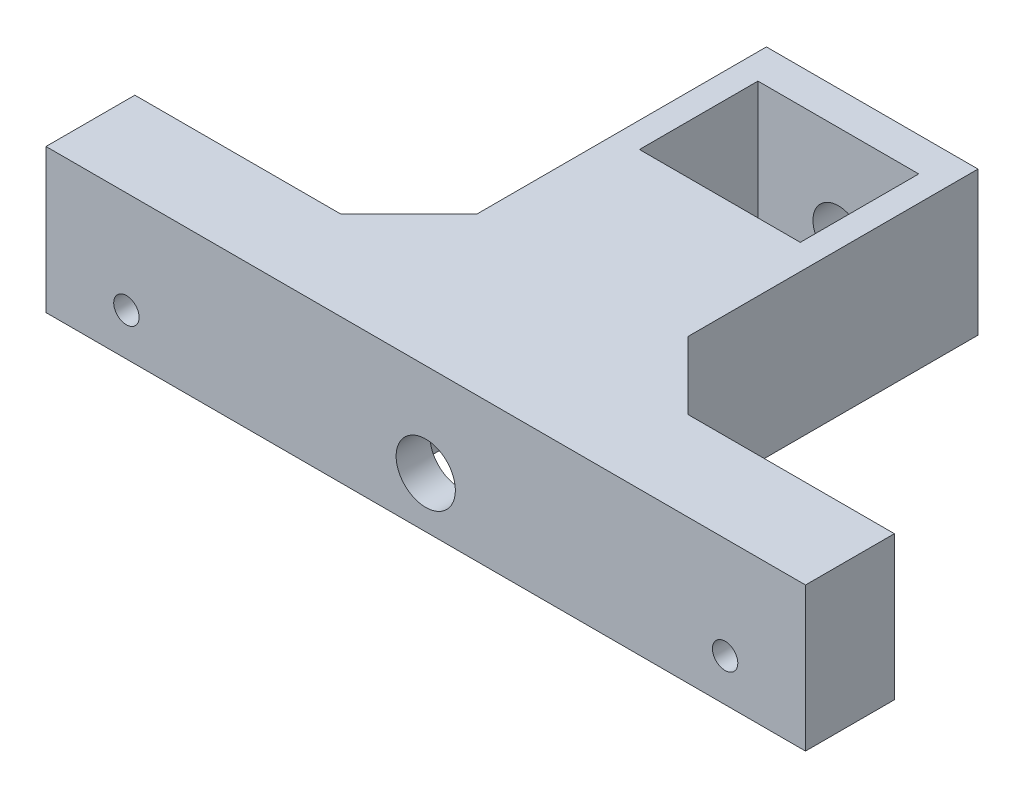
ISO-10303-21;
HEADER;
FILE_DESCRIPTION(('STEP AP214'),'2;1');
FILE_NAME('part.step','',(''),(''),'','','');
FILE_SCHEMA(('AUTOMOTIVE_DESIGN { 1 0 10303 214 1 1 1 1 }'));
ENDSEC;
DATA;
#1=APPLICATION_CONTEXT('core data for automotive mechanical design processes');
#2=APPLICATION_PROTOCOL_DEFINITION('international standard','automotive_design',2000,#1);
#3=PRODUCT_CONTEXT('',#1,'mechanical');
#4=PRODUCT('Part','Part','',(#3));
#5=PRODUCT_RELATED_PRODUCT_CATEGORY('part','',(#4));
#6=PRODUCT_DEFINITION_FORMATION('','',#4);
#7=PRODUCT_DEFINITION_CONTEXT('part definition',#1,'design');
#8=PRODUCT_DEFINITION('design','',#6,#7);
#9=PRODUCT_DEFINITION_SHAPE('','',#8);
#10=(LENGTH_UNIT() NAMED_UNIT(*) SI_UNIT(.MILLI.,.METRE.));
#11=(NAMED_UNIT(*) PLANE_ANGLE_UNIT() SI_UNIT($,.RADIAN.));
#12=(NAMED_UNIT(*) SI_UNIT($,.STERADIAN.) SOLID_ANGLE_UNIT());
#13=UNCERTAINTY_MEASURE_WITH_UNIT(LENGTH_MEASURE(1.E-05),#10,'distance_accuracy_value','');
#14=(GEOMETRIC_REPRESENTATION_CONTEXT(3) GLOBAL_UNCERTAINTY_ASSIGNED_CONTEXT((#13)) GLOBAL_UNIT_ASSIGNED_CONTEXT((#10,
#11,#12)) REPRESENTATION_CONTEXT('',''));
#15=CARTESIAN_POINT('',(0.,0.,0.));
#16=DIRECTION('',(0.,0.,1.));
#17=DIRECTION('',(1.,0.,0.));
#18=AXIS2_PLACEMENT_3D('',#15,#16,#17);
#19=CARTESIAN_POINT('',(7.5,12.,-4.));
#20=DIRECTION('',(0.,0.,-1.));
#21=DIRECTION('',(-1.,0.,0.));
#22=AXIS2_PLACEMENT_3D('',#19,#20,#21);
#23=PLANE('',#22);
#24=DIRECTION('',(1.,0.,0.));
#25=VECTOR('',#24,1.);
#26=CARTESIAN_POINT('',(7.5,12.,-4.));
#27=LINE('',#26,#25);
#28=CARTESIAN_POINT('',(-3.50000000000001,12.,-4.));
#29=VERTEX_POINT('',#28);
#30=CARTESIAN_POINT('',(3.49999999999997,12.,-4.));
#31=VERTEX_POINT('',#30);
#32=EDGE_CURVE('E322',#29,#31,#27,.T.);
#33=ORIENTED_EDGE('',*,*,#32,.T.);
#34=DIRECTION('',(0.,-1.,0.));
#35=VECTOR('',#34,1.);
#36=CARTESIAN_POINT('',(3.49999999999997,0.,-4.));
#37=LINE('',#36,#35);
#38=CARTESIAN_POINT('',(3.49999999999997,6.,-4.));
#39=VERTEX_POINT('',#38);
#40=EDGE_CURVE('E454',#31,#39,#37,.T.);
#41=ORIENTED_EDGE('',*,*,#40,.T.);
#42=CARTESIAN_POINT('',(0.,6.,-4.));
#43=DIRECTION('',(0.,0.,-1.));
#44=DIRECTION('',(-1.,0.,0.));
#45=AXIS2_PLACEMENT_3D('',#42,#43,#44);
#46=CIRCLE('',#45,3.5);
#47=CARTESIAN_POINT('',(-3.50000000000001,6.,-4.));
#48=VERTEX_POINT('',#47);
#49=EDGE_CURVE('E606',#39,#48,#46,.F.);
#50=ORIENTED_EDGE('',*,*,#49,.T.);
#51=DIRECTION('',(0.,1.,0.));
#52=VECTOR('',#51,1.);
#53=CARTESIAN_POINT('',(-3.50000000000001,12.,-4.));
#54=LINE('',#53,#52);
#55=EDGE_CURVE('E448',#48,#29,#54,.T.);
#56=ORIENTED_EDGE('',*,*,#55,.T.);
#57=EDGE_LOOP('',(#33,#41,#50,#56));
#58=FACE_BOUND('',#57,.T.);
#59=ADVANCED_FACE('F43',(#58),#23,.T.);
#60=CARTESIAN_POINT('',(44.87,12.,0.));
#61=DIRECTION('',(0.,0.,-1.));
#62=DIRECTION('',(-1.,0.,0.));
#63=AXIS2_PLACEMENT_3D('',#60,#61,#62);
#64=PLANE('',#63);
#65=CARTESIAN_POINT('',(0.,6.,0.));
#66=DIRECTION('',(0.,0.,1.));
#67=DIRECTION('',(1.,0.,0.));
#68=AXIS2_PLACEMENT_3D('',#65,#66,#67);
#69=CIRCLE('',#68,3.5);
#70=CARTESIAN_POINT('',(3.5,6.,0.));
#71=VERTEX_POINT('',#70);
#72=EDGE_CURVE('E611',#71,#71,#69,.T.);
#73=ORIENTED_EDGE('',*,*,#72,.F.);
#74=EDGE_LOOP('',(#73));
#75=FACE_BOUND('',#74,.T.);
#76=DIRECTION('',(1.,0.,0.));
#77=VECTOR('',#76,1.);
#78=CARTESIAN_POINT('',(44.87,0.,0.));
#79=LINE('',#78,#77);
#80=CARTESIAN_POINT('',(-44.87,0.,0.));
#81=VERTEX_POINT('',#80);
#82=CARTESIAN_POINT('',(44.87,0.,0.));
#83=VERTEX_POINT('',#82);
#84=EDGE_CURVE('E404',#81,#83,#79,.T.);
#85=ORIENTED_EDGE('',*,*,#84,.T.);
#86=DIRECTION('',(0.,-1.,0.));
#87=VECTOR('',#86,1.);
#88=CARTESIAN_POINT('',(44.87,12.,0.));
#89=LINE('',#88,#87);
#90=CARTESIAN_POINT('',(44.87,17.,0.));
#91=VERTEX_POINT('',#90);
#92=EDGE_CURVE('E409',#91,#83,#89,.T.);
#93=ORIENTED_EDGE('',*,*,#92,.F.);
#94=DIRECTION('',(1.,0.,0.));
#95=VECTOR('',#94,1.);
#96=CARTESIAN_POINT('',(-44.87,17.,0.));
#97=LINE('',#96,#95);
#98=CARTESIAN_POINT('',(-44.87,17.,0.));
#99=VERTEX_POINT('',#98);
#100=EDGE_CURVE('E299',#99,#91,#97,.T.);
#101=ORIENTED_EDGE('',*,*,#100,.F.);
#102=DIRECTION('',(0.,-1.,0.));
#103=VECTOR('',#102,1.);
#104=CARTESIAN_POINT('',(-44.87,12.,0.));
#105=LINE('',#104,#103);
#106=EDGE_CURVE('E412',#99,#81,#105,.T.);
#107=ORIENTED_EDGE('',*,*,#106,.T.);
#108=EDGE_LOOP('',(#85,#93,#101,#107));
#109=FACE_BOUND('',#108,.T.);
#110=CARTESIAN_POINT('',(35.37,5.00000000000001,0.));
#111=DIRECTION('',(0.,0.,-1.));
#112=DIRECTION('',(-1.,0.,0.));
#113=AXIS2_PLACEMENT_3D('',#110,#111,#112);
#114=CIRCLE('',#113,1.5);
#115=CARTESIAN_POINT('',(33.87,5.00000000000001,0.));
#116=VERTEX_POINT('',#115);
#117=EDGE_CURVE('E302',#116,#116,#114,.T.);
#118=ORIENTED_EDGE('',*,*,#117,.T.);
#119=EDGE_LOOP('',(#118));
#120=FACE_BOUND('',#119,.T.);
#121=CARTESIAN_POINT('',(-35.37,5.,0.));
#122=DIRECTION('',(0.,0.,1.));
#123=DIRECTION('',(1.,0.,0.));
#124=AXIS2_PLACEMENT_3D('',#121,#122,#123);
#125=CIRCLE('',#124,1.5);
#126=CARTESIAN_POINT('',(-33.87,5.,0.));
#127=VERTEX_POINT('',#126);
#128=EDGE_CURVE('E307',#127,#127,#125,.T.);
#129=ORIENTED_EDGE('',*,*,#128,.F.);
#130=EDGE_LOOP('',(#129));
#131=FACE_BOUND('',#130,.T.);
#132=ADVANCED_FACE('F542',(#75,#109,#120,#131),#64,.F.);
#133=CARTESIAN_POINT('',(0.,0.,0.));
#134=DIRECTION('',(0.,-1.,0.));
#135=DIRECTION('',(0.,0.,-1.));
#136=AXIS2_PLACEMENT_3D('',#133,#134,#135);
#137=PLANE('',#136);
#138=DIRECTION('',(-1.,0.,0.));
#139=VECTOR('',#138,1.);
#140=CARTESIAN_POINT('',(39.87,0.,-10.5));
#141=LINE('',#140,#139);
#142=CARTESIAN_POINT('',(44.87,0.,-10.5));
#143=VERTEX_POINT('',#142);
#144=CARTESIAN_POINT('',(39.87,0.,-10.5));
#145=VERTEX_POINT('',#144);
#146=EDGE_CURVE('E257',#143,#145,#141,.T.);
#147=ORIENTED_EDGE('',*,*,#146,.F.);
#148=DIRECTION('',(0.,0.,-1.));
#149=VECTOR('',#148,1.);
#150=CARTESIAN_POINT('',(44.87,0.,-10.5));
#151=LINE('',#150,#149);
#152=EDGE_CURVE('E359',#83,#143,#151,.T.);
#153=ORIENTED_EDGE('',*,*,#152,.F.);
#154=ORIENTED_EDGE('',*,*,#84,.F.);
#155=DIRECTION('',(0.,0.,1.));
#156=VECTOR('',#155,1.);
#157=CARTESIAN_POINT('',(-44.87,0.,0.));
#158=LINE('',#157,#156);
#159=CARTESIAN_POINT('',(-44.87,0.,-10.5));
#160=VERTEX_POINT('',#159);
#161=EDGE_CURVE('E402',#160,#81,#158,.T.);
#162=ORIENTED_EDGE('',*,*,#161,.F.);
#163=DIRECTION('',(-1.,0.,0.));
#164=VECTOR('',#163,1.);
#165=CARTESIAN_POINT('',(-44.87,0.,-10.5));
#166=LINE('',#165,#164);
#167=CARTESIAN_POINT('',(-39.87,0.,-10.5));
#168=VERTEX_POINT('',#167);
#169=EDGE_CURVE('E400',#168,#160,#166,.T.);
#170=ORIENTED_EDGE('',*,*,#169,.F.);
#171=DIRECTION('',(0.,0.,-1.));
#172=VECTOR('',#171,1.);
#173=CARTESIAN_POINT('',(-39.87,0.,-10.5));
#174=LINE('',#173,#172);
#175=CARTESIAN_POINT('',(-39.87,0.,-4.));
#176=VERTEX_POINT('',#175);
#177=EDGE_CURVE('E398',#176,#168,#174,.T.);
#178=ORIENTED_EDGE('',*,*,#177,.F.);
#179=DIRECTION('',(-1.,0.,0.));
#180=VECTOR('',#179,1.);
#181=CARTESIAN_POINT('',(-39.87,0.,-4.));
#182=LINE('',#181,#180);
#183=CARTESIAN_POINT('',(-30.87,0.,-4.));
#184=VERTEX_POINT('',#183);
#185=EDGE_CURVE('E396',#184,#176,#182,.T.);
#186=ORIENTED_EDGE('',*,*,#185,.F.);
#187=DIRECTION('',(0.,0.,1.));
#188=VECTOR('',#187,1.);
#189=CARTESIAN_POINT('',(-30.87,0.,-4.));
#190=LINE('',#189,#188);
#191=CARTESIAN_POINT('',(-30.87,0.,-10.5));
#192=VERTEX_POINT('',#191);
#193=EDGE_CURVE('E394',#192,#184,#190,.T.);
#194=ORIENTED_EDGE('',*,*,#193,.F.);
#195=DIRECTION('',(-1.,0.,0.));
#196=VECTOR('',#195,1.);
#197=CARTESIAN_POINT('',(-30.87,0.,-10.5));
#198=LINE('',#197,#196);
#199=CARTESIAN_POINT('',(-20.5,0.,-10.5));
#200=VERTEX_POINT('',#199);
#201=EDGE_CURVE('E392',#200,#192,#198,.T.);
#202=ORIENTED_EDGE('',*,*,#201,.F.);
#203=DIRECTION('',(-0.70710678118655,0.,0.707106781186545));
#204=VECTOR('',#203,1.);
#205=CARTESIAN_POINT('',(-20.5,0.,-10.5));
#206=LINE('',#205,#204);
#207=CARTESIAN_POINT('',(-12.5,0.,-18.5));
#208=VERTEX_POINT('',#207);
#209=EDGE_CURVE('E52',#200,#208,#206,.F.);
#210=ORIENTED_EDGE('',*,*,#209,.T.);
#211=DIRECTION('',(0.,0.,1.));
#212=VECTOR('',#211,1.);
#213=CARTESIAN_POINT('',(-12.5,0.,-52.75));
#214=LINE('',#213,#212);
#215=CARTESIAN_POINT('',(-12.5,0.,-52.75));
#216=VERTEX_POINT('',#215);
#217=EDGE_CURVE('E390',#216,#208,#214,.T.);
#218=ORIENTED_EDGE('',*,*,#217,.F.);
#219=DIRECTION('',(-1.,0.,0.));
#220=VECTOR('',#219,1.);
#221=CARTESIAN_POINT('',(-12.5,0.,-52.75));
#222=LINE('',#221,#220);
#223=CARTESIAN_POINT('',(12.5,0.,-52.75));
#224=VERTEX_POINT('',#223);
#225=EDGE_CURVE('E388',#224,#216,#222,.T.);
#226=ORIENTED_EDGE('',*,*,#225,.F.);
#227=DIRECTION('',(0.,0.,-1.));
#228=VECTOR('',#227,1.);
#229=CARTESIAN_POINT('',(12.5,0.,-52.75));
#230=LINE('',#229,#228);
#231=CARTESIAN_POINT('',(12.5,0.,-18.5000000000001));
#232=VERTEX_POINT('',#231);
#233=EDGE_CURVE('E386',#232,#224,#230,.T.);
#234=ORIENTED_EDGE('',*,*,#233,.F.);
#235=DIRECTION('',(-0.707106781186544,0.,-0.707106781186551));
#236=VECTOR('',#235,1.);
#237=CARTESIAN_POINT('',(12.5,0.,-18.5000000000001));
#238=LINE('',#237,#236);
#239=CARTESIAN_POINT('',(20.5,0.,-10.5));
#240=VERTEX_POINT('',#239);
#241=EDGE_CURVE('E497',#232,#240,#238,.F.);
#242=ORIENTED_EDGE('',*,*,#241,.T.);
#243=DIRECTION('',(-1.,0.,0.));
#244=VECTOR('',#243,1.);
#245=CARTESIAN_POINT('',(12.5,0.,-10.5));
#246=LINE('',#245,#244);
#247=CARTESIAN_POINT('',(30.87,0.,-10.5));
#248=VERTEX_POINT('',#247);
#249=EDGE_CURVE('E383',#248,#240,#246,.T.);
#250=ORIENTED_EDGE('',*,*,#249,.F.);
#251=DIRECTION('',(0.,0.,-1.));
#252=VECTOR('',#251,1.);
#253=CARTESIAN_POINT('',(30.87,0.,-10.5));
#254=LINE('',#253,#252);
#255=CARTESIAN_POINT('',(30.87,0.,-4.00000000000001));
#256=VERTEX_POINT('',#255);
#257=EDGE_CURVE('E381',#256,#248,#254,.T.);
#258=ORIENTED_EDGE('',*,*,#257,.F.);
#259=DIRECTION('',(-1.,0.,0.));
#260=VECTOR('',#259,1.);
#261=CARTESIAN_POINT('',(30.87,0.,-4.00000000000001));
#262=LINE('',#261,#260);
#263=CARTESIAN_POINT('',(39.87,0.,-4.));
#264=VERTEX_POINT('',#263);
#265=EDGE_CURVE('E379',#264,#256,#262,.T.);
#266=ORIENTED_EDGE('',*,*,#265,.F.);
#267=DIRECTION('',(0.,0.,1.));
#268=VECTOR('',#267,1.);
#269=CARTESIAN_POINT('',(39.87,0.,-4.));
#270=LINE('',#269,#268);
#271=EDGE_CURVE('E377',#145,#264,#270,.T.);
#272=ORIENTED_EDGE('',*,*,#271,.F.);
#273=EDGE_LOOP('',(#147,#153,#154,#162,#170,#178,#186,#194,#202,#210,#218,#226,#234,#242,#250,
#258,#266,#272));
#274=FACE_BOUND('',#273,.T.);
#275=DIRECTION('',(-1.,0.,0.));
#276=VECTOR('',#275,1.);
#277=CARTESIAN_POINT('',(-9.5,0.,-48.75));
#278=LINE('',#277,#276);
#279=CARTESIAN_POINT('',(9.49999999999999,0.,-48.75));
#280=VERTEX_POINT('',#279);
#281=CARTESIAN_POINT('',(-9.5,0.,-48.75));
#282=VERTEX_POINT('',#281);
#283=EDGE_CURVE('E348',#280,#282,#278,.T.);
#284=ORIENTED_EDGE('',*,*,#283,.T.);
#285=DIRECTION('',(0.,0.,1.));
#286=VECTOR('',#285,1.);
#287=CARTESIAN_POINT('',(-9.5,0.,-48.75));
#288=LINE('',#287,#286);
#289=CARTESIAN_POINT('',(-9.5,0.,-34.75));
#290=VERTEX_POINT('',#289);
#291=EDGE_CURVE('E332',#282,#290,#288,.T.);
#292=ORIENTED_EDGE('',*,*,#291,.T.);
#293=DIRECTION('',(1.,0.,0.));
#294=VECTOR('',#293,1.);
#295=CARTESIAN_POINT('',(-9.5,0.,-34.75));
#296=LINE('',#295,#294);
#297=CARTESIAN_POINT('',(9.49999999999999,0.,-34.75));
#298=VERTEX_POINT('',#297);
#299=EDGE_CURVE('E254',#290,#298,#296,.T.);
#300=ORIENTED_EDGE('',*,*,#299,.T.);
#301=DIRECTION('',(0.,0.,-1.));
#302=VECTOR('',#301,1.);
#303=CARTESIAN_POINT('',(9.49999999999999,0.,-48.75));
#304=LINE('',#303,#302);
#305=EDGE_CURVE('E345',#298,#280,#304,.T.);
#306=ORIENTED_EDGE('',*,*,#305,.T.);
#307=EDGE_LOOP('',(#284,#292,#300,#306));
#308=FACE_BOUND('',#307,.T.);
#309=DIRECTION('',(-1.,0.,0.));
#310=VECTOR('',#309,1.);
#311=CARTESIAN_POINT('',(-7.5,0.,-31.75));
#312=LINE('',#311,#310);
#313=CARTESIAN_POINT('',(3.49999999999999,0.,-31.75));
#314=VERTEX_POINT('',#313);
#315=CARTESIAN_POINT('',(-3.49999999999997,0.,-31.75));
#316=VERTEX_POINT('',#315);
#317=EDGE_CURVE('E338',#314,#316,#312,.T.);
#318=ORIENTED_EDGE('',*,*,#317,.T.);
#319=DIRECTION('',(0.707106781186551,0.,-0.707106781186544));
#320=VECTOR('',#319,1.);
#321=CARTESIAN_POINT('',(-3.49999999999997,0.,-31.75));
#322=LINE('',#321,#320);
#323=CARTESIAN_POINT('',(-7.5,0.,-27.75));
#324=VERTEX_POINT('',#323);
#325=EDGE_CURVE('E484',#316,#324,#322,.F.);
#326=ORIENTED_EDGE('',*,*,#325,.T.);
#327=DIRECTION('',(0.,0.,1.));
#328=VECTOR('',#327,1.);
#329=CARTESIAN_POINT('',(-7.5,0.,-31.75));
#330=LINE('',#329,#328);
#331=CARTESIAN_POINT('',(-7.5,0.,-8.00000000000003));
#332=VERTEX_POINT('',#331);
#333=EDGE_CURVE('E323',#324,#332,#330,.T.);
#334=ORIENTED_EDGE('',*,*,#333,.T.);
#335=DIRECTION('',(-0.707106781186544,0.,-0.707106781186551));
#336=VECTOR('',#335,1.);
#337=CARTESIAN_POINT('',(-7.5,0.,-8.00000000000003));
#338=LINE('',#337,#336);
#339=CARTESIAN_POINT('',(-3.50000000000001,0.,-4.));
#340=VERTEX_POINT('',#339);
#341=EDGE_CURVE('E486',#332,#340,#338,.F.);
#342=ORIENTED_EDGE('',*,*,#341,.T.);
#343=DIRECTION('',(1.,0.,0.));
#344=VECTOR('',#343,1.);
#345=CARTESIAN_POINT('',(7.5,0.,-4.));
#346=LINE('',#345,#344);
#347=CARTESIAN_POINT('',(3.49999999999997,0.,-4.));
#348=VERTEX_POINT('',#347);
#349=EDGE_CURVE('E314',#340,#348,#346,.T.);
#350=ORIENTED_EDGE('',*,*,#349,.T.);
#351=DIRECTION('',(-0.707106781186551,0.,0.707106781186544));
#352=VECTOR('',#351,1.);
#353=CARTESIAN_POINT('',(3.49999999999997,0.,-4.));
#354=LINE('',#353,#352);
#355=CARTESIAN_POINT('',(7.5,0.,-7.99999999999999));
#356=VERTEX_POINT('',#355);
#357=EDGE_CURVE('E480',#348,#356,#354,.F.);
#358=ORIENTED_EDGE('',*,*,#357,.T.);
#359=DIRECTION('',(0.,0.,-1.));
#360=VECTOR('',#359,1.);
#361=CARTESIAN_POINT('',(7.5,0.,-31.75));
#362=LINE('',#361,#360);
#363=CARTESIAN_POINT('',(7.5,0.,-27.75));
#364=VERTEX_POINT('',#363);
#365=EDGE_CURVE('E335',#356,#364,#362,.T.);
#366=ORIENTED_EDGE('',*,*,#365,.T.);
#367=DIRECTION('',(0.707106781186544,0.,0.707106781186551));
#368=VECTOR('',#367,1.);
#369=CARTESIAN_POINT('',(7.5,0.,-27.75));
#370=LINE('',#369,#368);
#371=EDGE_CURVE('E482',#364,#314,#370,.F.);
#372=ORIENTED_EDGE('',*,*,#371,.T.);
#373=EDGE_LOOP('',(#318,#326,#334,#342,#350,#358,#366,#372));
#374=FACE_BOUND('',#373,.T.);
#375=ADVANCED_FACE('F515',(#274,#308,#374),#137,.T.);
#376=CARTESIAN_POINT('',(39.87,12.,-4.));
#377=DIRECTION('',(1.,0.,0.));
#378=DIRECTION('',(0.,0.,-1.));
#379=AXIS2_PLACEMENT_3D('',#376,#377,#378);
#380=PLANE('',#379);
#381=ORIENTED_EDGE('',*,*,#271,.T.);
#382=DIRECTION('',(0.,-1.,0.));
#383=VECTOR('',#382,1.);
#384=CARTESIAN_POINT('',(39.87,12.,-4.));
#385=LINE('',#384,#383);
#386=CARTESIAN_POINT('',(39.87,12.,-4.));
#387=VERTEX_POINT('',#386);
#388=EDGE_CURVE('E442',#387,#264,#385,.T.);
#389=ORIENTED_EDGE('',*,*,#388,.F.);
#390=DIRECTION('',(0.,0.,1.));
#391=VECTOR('',#390,1.);
#392=CARTESIAN_POINT('',(39.87,12.,-4.));
#393=LINE('',#392,#391);
#394=CARTESIAN_POINT('',(39.87,12.,-10.5));
#395=VERTEX_POINT('',#394);
#396=EDGE_CURVE('E355',#395,#387,#393,.T.);
#397=ORIENTED_EDGE('',*,*,#396,.F.);
#398=DIRECTION('',(0.,-1.,0.));
#399=VECTOR('',#398,1.);
#400=CARTESIAN_POINT('',(39.87,12.,-10.5));
#401=LINE('',#400,#399);
#402=EDGE_CURVE('E445',#395,#145,#401,.T.);
#403=ORIENTED_EDGE('',*,*,#402,.T.);
#404=EDGE_LOOP('',(#381,#389,#397,#403));
#405=FACE_BOUND('',#404,.T.);
#406=ADVANCED_FACE('F534',(#405),#380,.F.);
#407=CARTESIAN_POINT('',(30.87,12.,-4.00000000000001));
#408=DIRECTION('',(0.,0.,1.));
#409=DIRECTION('',(1.,0.,0.));
#410=AXIS2_PLACEMENT_3D('',#407,#408,#409);
#411=PLANE('',#410);
#412=CARTESIAN_POINT('',(35.37,5.00000000000001,-4.));
#413=DIRECTION('',(0.,0.,1.));
#414=DIRECTION('',(1.,0.,0.));
#415=AXIS2_PLACEMENT_3D('',#412,#413,#414);
#416=CIRCLE('',#415,1.5);
#417=CARTESIAN_POINT('',(36.87,5.00000000000001,-4.));
#418=VERTEX_POINT('',#417);
#419=EDGE_CURVE('E311',#418,#418,#416,.T.);
#420=ORIENTED_EDGE('',*,*,#419,.T.);
#421=EDGE_LOOP('',(#420));
#422=FACE_BOUND('',#421,.T.);
#423=ORIENTED_EDGE('',*,*,#265,.T.);
#424=DIRECTION('',(0.,-1.,0.));
#425=VECTOR('',#424,1.);
#426=CARTESIAN_POINT('',(30.87,12.,-4.00000000000001));
#427=LINE('',#426,#425);
#428=CARTESIAN_POINT('',(30.87,12.,-4.00000000000001));
#429=VERTEX_POINT('',#428);
#430=EDGE_CURVE('E439',#429,#256,#427,.T.);
#431=ORIENTED_EDGE('',*,*,#430,.F.);
#432=DIRECTION('',(-1.,0.,0.));
#433=VECTOR('',#432,1.);
#434=CARTESIAN_POINT('',(30.87,12.,-4.00000000000001));
#435=LINE('',#434,#433);
#436=EDGE_CURVE('E358',#387,#429,#435,.T.);
#437=ORIENTED_EDGE('',*,*,#436,.F.);
#438=ORIENTED_EDGE('',*,*,#388,.T.);
#439=EDGE_LOOP('',(#423,#431,#437,#438));
#440=FACE_BOUND('',#439,.T.);
#441=ADVANCED_FACE('F530',(#422,#440),#411,.F.);
#442=CARTESIAN_POINT('',(30.87,12.,-10.5));
#443=DIRECTION('',(-1.,0.,0.));
#444=DIRECTION('',(0.,0.,1.));
#445=AXIS2_PLACEMENT_3D('',#442,#443,#444);
#446=PLANE('',#445);
#447=ORIENTED_EDGE('',*,*,#257,.T.);
#448=DIRECTION('',(0.,-1.,0.));
#449=VECTOR('',#448,1.);
#450=CARTESIAN_POINT('',(30.87,12.,-10.5));
#451=LINE('',#450,#449);
#452=CARTESIAN_POINT('',(30.87,12.,-10.5));
#453=VERTEX_POINT('',#452);
#454=EDGE_CURVE('E436',#453,#248,#451,.T.);
#455=ORIENTED_EDGE('',*,*,#454,.F.);
#456=DIRECTION('',(0.,0.,-1.));
#457=VECTOR('',#456,1.);
#458=CARTESIAN_POINT('',(30.87,12.,-10.5));
#459=LINE('',#458,#457);
#460=EDGE_CURVE('E362',#429,#453,#459,.T.);
#461=ORIENTED_EDGE('',*,*,#460,.F.);
#462=ORIENTED_EDGE('',*,*,#430,.T.);
#463=EDGE_LOOP('',(#447,#455,#461,#462));
#464=FACE_BOUND('',#463,.T.);
#465=ADVANCED_FACE('F525',(#464),#446,.F.);
#466=CARTESIAN_POINT('',(12.5,12.,-10.5));
#467=DIRECTION('',(0.,0.,1.));
#468=DIRECTION('',(1.,0.,0.));
#469=AXIS2_PLACEMENT_3D('',#466,#467,#468);
#470=PLANE('',#469);
#471=ORIENTED_EDGE('',*,*,#249,.T.);
#472=DIRECTION('',(0.,1.,0.));
#473=VECTOR('',#472,1.);
#474=CARTESIAN_POINT('',(20.5,17.,-10.5));
#475=LINE('',#474,#473);
#476=CARTESIAN_POINT('',(20.5,17.,-10.5));
#477=VERTEX_POINT('',#476);
#478=EDGE_CURVE('E491',#240,#477,#475,.T.);
#479=ORIENTED_EDGE('',*,*,#478,.T.);
#480=DIRECTION('',(-1.,0.,0.));
#481=VECTOR('',#480,1.);
#482=CARTESIAN_POINT('',(44.87,17.,-10.5));
#483=LINE('',#482,#481);
#484=CARTESIAN_POINT('',(44.87,17.,-10.5));
#485=VERTEX_POINT('',#484);
#486=EDGE_CURVE('E283',#485,#477,#483,.T.);
#487=ORIENTED_EDGE('',*,*,#486,.F.);
#488=DIRECTION('',(0.,-1.,0.));
#489=VECTOR('',#488,1.);
#490=CARTESIAN_POINT('',(44.87,12.,-10.5));
#491=LINE('',#490,#489);
#492=EDGE_CURVE('E374',#485,#143,#491,.T.);
#493=ORIENTED_EDGE('',*,*,#492,.T.);
#494=ORIENTED_EDGE('',*,*,#146,.T.);
#495=ORIENTED_EDGE('',*,*,#402,.F.);
#496=DIRECTION('',(-1.,0.,0.));
#497=VECTOR('',#496,1.);
#498=CARTESIAN_POINT('',(30.87,12.,-10.5));
#499=LINE('',#498,#497);
#500=EDGE_CURVE('E279',#395,#453,#499,.T.);
#501=ORIENTED_EDGE('',*,*,#500,.T.);
#502=ORIENTED_EDGE('',*,*,#454,.T.);
#503=EDGE_LOOP('',(#471,#479,#487,#493,#494,#495,#501,#502));
#504=FACE_BOUND('',#503,.T.);
#505=ADVANCED_FACE('F520',(#504),#470,.F.);
#506=CARTESIAN_POINT('',(12.5,12.,-52.75));
#507=DIRECTION('',(-1.,0.,0.));
#508=DIRECTION('',(0.,0.,1.));
#509=AXIS2_PLACEMENT_3D('',#506,#507,#508);
#510=PLANE('',#509);
#511=DIRECTION('',(0.,0.,-1.));
#512=VECTOR('',#511,1.);
#513=CARTESIAN_POINT('',(12.5,17.,-10.5));
#514=LINE('',#513,#512);
#515=CARTESIAN_POINT('',(12.5,17.,-18.5000000000001));
#516=VERTEX_POINT('',#515);
#517=CARTESIAN_POINT('',(12.5,17.,-52.75));
#518=VERTEX_POINT('',#517);
#519=EDGE_CURVE('E287',#516,#518,#514,.T.);
#520=ORIENTED_EDGE('',*,*,#519,.F.);
#521=DIRECTION('',(0.,-1.,0.));
#522=VECTOR('',#521,1.);
#523=CARTESIAN_POINT('',(12.5,0.,-18.5000000000001));
#524=LINE('',#523,#522);
#525=EDGE_CURVE('E488',#516,#232,#524,.T.);
#526=ORIENTED_EDGE('',*,*,#525,.T.);
#527=ORIENTED_EDGE('',*,*,#233,.T.);
#528=DIRECTION('',(0.,-1.,0.));
#529=VECTOR('',#528,1.);
#530=CARTESIAN_POINT('',(12.5,12.,-52.75));
#531=LINE('',#530,#529);
#532=EDGE_CURVE('E433',#518,#224,#531,.T.);
#533=ORIENTED_EDGE('',*,*,#532,.F.);
#534=EDGE_LOOP('',(#520,#526,#527,#533));
#535=FACE_BOUND('',#534,.T.);
#536=ADVANCED_FACE('F509',(#535),#510,.F.);
#537=CARTESIAN_POINT('',(-12.5,12.,-52.75));
#538=DIRECTION('',(0.,0.,1.));
#539=DIRECTION('',(1.,0.,0.));
#540=AXIS2_PLACEMENT_3D('',#537,#538,#539);
#541=PLANE('',#540);
#542=CARTESIAN_POINT('',(0.,6.,-52.75));
#543=DIRECTION('',(0.,0.,-1.));
#544=DIRECTION('',(-1.,0.,0.));
#545=AXIS2_PLACEMENT_3D('',#542,#543,#544);
#546=CIRCLE('',#545,3.);
#547=CARTESIAN_POINT('',(-3.00000000000002,6.,-52.75));
#548=VERTEX_POINT('',#547);
#549=EDGE_CURVE('E605',#548,#548,#546,.T.);
#550=ORIENTED_EDGE('',*,*,#549,.F.);
#551=EDGE_LOOP('',(#550));
#552=FACE_BOUND('',#551,.T.);
#553=ORIENTED_EDGE('',*,*,#225,.T.);
#554=DIRECTION('',(0.,-1.,0.));
#555=VECTOR('',#554,1.);
#556=CARTESIAN_POINT('',(-12.5,12.,-52.75));
#557=LINE('',#556,#555);
#558=CARTESIAN_POINT('',(-12.5,17.,-52.75));
#559=VERTEX_POINT('',#558);
#560=EDGE_CURVE('E430',#559,#216,#557,.T.);
#561=ORIENTED_EDGE('',*,*,#560,.F.);
#562=DIRECTION('',(-1.,0.,0.));
#563=VECTOR('',#562,1.);
#564=CARTESIAN_POINT('',(12.5,17.,-52.75));
#565=LINE('',#564,#563);
#566=EDGE_CURVE('E289',#518,#559,#565,.T.);
#567=ORIENTED_EDGE('',*,*,#566,.F.);
#568=ORIENTED_EDGE('',*,*,#532,.T.);
#569=EDGE_LOOP('',(#553,#561,#567,#568));
#570=FACE_BOUND('',#569,.T.);
#571=ADVANCED_FACE('F652',(#552,#570),#541,.F.);
#572=CARTESIAN_POINT('',(-12.5,12.,-52.75));
#573=DIRECTION('',(1.,0.,0.));
#574=DIRECTION('',(0.,0.,-1.));
#575=AXIS2_PLACEMENT_3D('',#572,#573,#574);
#576=PLANE('',#575);
#577=ORIENTED_EDGE('',*,*,#217,.T.);
#578=DIRECTION('',(0.,1.,0.));
#579=VECTOR('',#578,1.);
#580=CARTESIAN_POINT('',(-12.5,17.,-18.5));
#581=LINE('',#580,#579);
#582=CARTESIAN_POINT('',(-12.5,17.,-18.5));
#583=VERTEX_POINT('',#582);
#584=EDGE_CURVE('E59',#208,#583,#581,.T.);
#585=ORIENTED_EDGE('',*,*,#584,.T.);
#586=DIRECTION('',(0.,0.,1.));
#587=VECTOR('',#586,1.);
#588=CARTESIAN_POINT('',(-12.5,17.,-52.75));
#589=LINE('',#588,#587);
#590=EDGE_CURVE('E292',#559,#583,#589,.T.);
#591=ORIENTED_EDGE('',*,*,#590,.F.);
#592=ORIENTED_EDGE('',*,*,#560,.T.);
#593=EDGE_LOOP('',(#577,#585,#591,#592));
#594=FACE_BOUND('',#593,.T.);
#595=ADVANCED_FACE('F649',(#594),#576,.F.);
#596=CARTESIAN_POINT('',(-30.87,12.,-4.));
#597=DIRECTION('',(1.,0.,0.));
#598=DIRECTION('',(0.,0.,-1.));
#599=AXIS2_PLACEMENT_3D('',#596,#597,#598);
#600=PLANE('',#599);
#601=ORIENTED_EDGE('',*,*,#193,.T.);
#602=DIRECTION('',(0.,-1.,0.));
#603=VECTOR('',#602,1.);
#604=CARTESIAN_POINT('',(-30.87,12.,-4.));
#605=LINE('',#604,#603);
#606=CARTESIAN_POINT('',(-30.87,12.,-4.));
#607=VERTEX_POINT('',#606);
#608=EDGE_CURVE('E424',#607,#184,#605,.T.);
#609=ORIENTED_EDGE('',*,*,#608,.F.);
#610=DIRECTION('',(0.,0.,1.));
#611=VECTOR('',#610,1.);
#612=CARTESIAN_POINT('',(-30.87,12.,-4.));
#613=LINE('',#612,#611);
#614=CARTESIAN_POINT('',(-30.87,12.,-10.5));
#615=VERTEX_POINT('',#614);
#616=EDGE_CURVE('E365',#615,#607,#613,.T.);
#617=ORIENTED_EDGE('',*,*,#616,.F.);
#618=DIRECTION('',(0.,-1.,0.));
#619=VECTOR('',#618,1.);
#620=CARTESIAN_POINT('',(-30.87,12.,-10.5));
#621=LINE('',#620,#619);
#622=EDGE_CURVE('E427',#615,#192,#621,.T.);
#623=ORIENTED_EDGE('',*,*,#622,.T.);
#624=EDGE_LOOP('',(#601,#609,#617,#623));
#625=FACE_BOUND('',#624,.T.);
#626=ADVANCED_FACE('F565',(#625),#600,.F.);
#627=CARTESIAN_POINT('',(-39.87,12.,-4.));
#628=DIRECTION('',(0.,0.,1.));
#629=DIRECTION('',(1.,0.,0.));
#630=AXIS2_PLACEMENT_3D('',#627,#628,#629);
#631=PLANE('',#630);
#632=CARTESIAN_POINT('',(-35.37,5.,-4.));
#633=DIRECTION('',(0.,0.,1.));
#634=DIRECTION('',(1.,0.,0.));
#635=AXIS2_PLACEMENT_3D('',#632,#633,#634);
#636=CIRCLE('',#635,1.5);
#637=CARTESIAN_POINT('',(-33.87,5.,-4.));
#638=VERTEX_POINT('',#637);
#639=EDGE_CURVE('E310',#638,#638,#636,.F.);
#640=ORIENTED_EDGE('',*,*,#639,.F.);
#641=EDGE_LOOP('',(#640));
#642=FACE_BOUND('',#641,.T.);
#643=ORIENTED_EDGE('',*,*,#185,.T.);
#644=DIRECTION('',(0.,-1.,0.));
#645=VECTOR('',#644,1.);
#646=CARTESIAN_POINT('',(-39.87,12.,-4.));
#647=LINE('',#646,#645);
#648=CARTESIAN_POINT('',(-39.87,12.,-4.));
#649=VERTEX_POINT('',#648);
#650=EDGE_CURVE('E421',#649,#176,#647,.T.);
#651=ORIENTED_EDGE('',*,*,#650,.F.);
#652=DIRECTION('',(-1.,0.,0.));
#653=VECTOR('',#652,1.);
#654=CARTESIAN_POINT('',(-39.87,12.,-4.));
#655=LINE('',#654,#653);
#656=EDGE_CURVE('E368',#607,#649,#655,.T.);
#657=ORIENTED_EDGE('',*,*,#656,.F.);
#658=ORIENTED_EDGE('',*,*,#608,.T.);
#659=EDGE_LOOP('',(#643,#651,#657,#658));
#660=FACE_BOUND('',#659,.T.);
#661=ADVANCED_FACE('F562',(#642,#660),#631,.F.);
#662=CARTESIAN_POINT('',(-39.87,12.,-10.5));
#663=DIRECTION('',(-1.,0.,0.));
#664=DIRECTION('',(0.,0.,1.));
#665=AXIS2_PLACEMENT_3D('',#662,#663,#664);
#666=PLANE('',#665);
#667=ORIENTED_EDGE('',*,*,#177,.T.);
#668=DIRECTION('',(0.,-1.,0.));
#669=VECTOR('',#668,1.);
#670=CARTESIAN_POINT('',(-39.87,12.,-10.5));
#671=LINE('',#670,#669);
#672=CARTESIAN_POINT('',(-39.87,12.,-10.5));
#673=VERTEX_POINT('',#672);
#674=EDGE_CURVE('E418',#673,#168,#671,.T.);
#675=ORIENTED_EDGE('',*,*,#674,.F.);
#676=DIRECTION('',(0.,0.,-1.));
#677=VECTOR('',#676,1.);
#678=CARTESIAN_POINT('',(-39.87,12.,-10.5));
#679=LINE('',#678,#677);
#680=EDGE_CURVE('E371',#649,#673,#679,.T.);
#681=ORIENTED_EDGE('',*,*,#680,.F.);
#682=ORIENTED_EDGE('',*,*,#650,.T.);
#683=EDGE_LOOP('',(#667,#675,#681,#682));
#684=FACE_BOUND('',#683,.T.);
#685=ADVANCED_FACE('F558',(#684),#666,.F.);
#686=CARTESIAN_POINT('',(-44.87,12.,-10.5));
#687=DIRECTION('',(0.,0.,1.));
#688=DIRECTION('',(1.,0.,0.));
#689=AXIS2_PLACEMENT_3D('',#686,#687,#688);
#690=PLANE('',#689);
#691=DIRECTION('',(-1.,0.,0.));
#692=VECTOR('',#691,1.);
#693=CARTESIAN_POINT('',(-12.5,17.,-10.5));
#694=LINE('',#693,#692);
#695=CARTESIAN_POINT('',(-20.5,17.,-10.5));
#696=VERTEX_POINT('',#695);
#697=CARTESIAN_POINT('',(-44.87,17.,-10.5));
#698=VERTEX_POINT('',#697);
#699=EDGE_CURVE('E294',#696,#698,#694,.T.);
#700=ORIENTED_EDGE('',*,*,#699,.F.);
#701=DIRECTION('',(0.,-1.,0.));
#702=VECTOR('',#701,1.);
#703=CARTESIAN_POINT('',(-20.5,0.,-10.5));
#704=LINE('',#703,#702);
#705=EDGE_CURVE('E493',#696,#200,#704,.T.);
#706=ORIENTED_EDGE('',*,*,#705,.T.);
#707=ORIENTED_EDGE('',*,*,#201,.T.);
#708=ORIENTED_EDGE('',*,*,#622,.F.);
#709=DIRECTION('',(-1.,0.,0.));
#710=VECTOR('',#709,1.);
#711=CARTESIAN_POINT('',(-39.87,12.,-10.5));
#712=LINE('',#711,#710);
#713=EDGE_CURVE('E284',#615,#673,#712,.T.);
#714=ORIENTED_EDGE('',*,*,#713,.T.);
#715=ORIENTED_EDGE('',*,*,#674,.T.);
#716=ORIENTED_EDGE('',*,*,#169,.T.);
#717=DIRECTION('',(0.,-1.,0.));
#718=VECTOR('',#717,1.);
#719=CARTESIAN_POINT('',(-44.87,12.,-10.5));
#720=LINE('',#719,#718);
#721=EDGE_CURVE('E415',#698,#160,#720,.T.);
#722=ORIENTED_EDGE('',*,*,#721,.F.);
#723=EDGE_LOOP('',(#700,#706,#707,#708,#714,#715,#716,#722));
#724=FACE_BOUND('',#723,.T.);
#725=ADVANCED_FACE('F553',(#724),#690,.F.);
#726=CARTESIAN_POINT('',(-44.87,12.,0.));
#727=DIRECTION('',(1.,0.,0.));
#728=DIRECTION('',(0.,0.,-1.));
#729=AXIS2_PLACEMENT_3D('',#726,#727,#728);
#730=PLANE('',#729);
#731=ORIENTED_EDGE('',*,*,#161,.T.);
#732=ORIENTED_EDGE('',*,*,#106,.F.);
#733=DIRECTION('',(0.,0.,1.));
#734=VECTOR('',#733,1.);
#735=CARTESIAN_POINT('',(-44.87,17.,-10.5));
#736=LINE('',#735,#734);
#737=EDGE_CURVE('E296',#698,#99,#736,.T.);
#738=ORIENTED_EDGE('',*,*,#737,.F.);
#739=ORIENTED_EDGE('',*,*,#721,.T.);
#740=EDGE_LOOP('',(#731,#732,#738,#739));
#741=FACE_BOUND('',#740,.T.);
#742=ADVANCED_FACE('F547',(#741),#730,.F.);
#743=CARTESIAN_POINT('',(44.87,12.,-10.5));
#744=DIRECTION('',(-1.,0.,0.));
#745=DIRECTION('',(0.,0.,1.));
#746=AXIS2_PLACEMENT_3D('',#743,#744,#745);
#747=PLANE('',#746);
#748=ORIENTED_EDGE('',*,*,#152,.T.);
#749=ORIENTED_EDGE('',*,*,#492,.F.);
#750=DIRECTION('',(0.,0.,-1.));
#751=VECTOR('',#750,1.);
#752=CARTESIAN_POINT('',(44.87,17.,0.));
#753=LINE('',#752,#751);
#754=EDGE_CURVE('E280',#91,#485,#753,.T.);
#755=ORIENTED_EDGE('',*,*,#754,.F.);
#756=ORIENTED_EDGE('',*,*,#92,.T.);
#757=EDGE_LOOP('',(#748,#749,#755,#756));
#758=FACE_BOUND('',#757,.T.);
#759=ADVANCED_FACE('F537',(#758),#747,.F.);
#760=CARTESIAN_POINT('',(-9.5,12.,-48.75));
#761=DIRECTION('',(1.,0.,0.));
#762=DIRECTION('',(0.,0.,-1.));
#763=AXIS2_PLACEMENT_3D('',#760,#761,#762);
#764=PLANE('',#763);
#765=ORIENTED_EDGE('',*,*,#291,.F.);
#766=DIRECTION('',(0.,-1.,0.));
#767=VECTOR('',#766,1.);
#768=CARTESIAN_POINT('',(-9.5,12.,-48.75));
#769=LINE('',#768,#767);
#770=CARTESIAN_POINT('',(-9.5,17.,-48.75));
#771=VERTEX_POINT('',#770);
#772=EDGE_CURVE('E264',#771,#282,#769,.T.);
#773=ORIENTED_EDGE('',*,*,#772,.F.);
#774=DIRECTION('',(0.,0.,1.));
#775=VECTOR('',#774,1.);
#776=CARTESIAN_POINT('',(-9.5,17.,-48.75));
#777=LINE('',#776,#775);
#778=CARTESIAN_POINT('',(-9.5,17.,-34.75));
#779=VERTEX_POINT('',#778);
#780=EDGE_CURVE('E261',#771,#779,#777,.T.);
#781=ORIENTED_EDGE('',*,*,#780,.T.);
#782=DIRECTION('',(0.,-1.,0.));
#783=VECTOR('',#782,1.);
#784=CARTESIAN_POINT('',(-9.5,12.,-34.75));
#785=LINE('',#784,#783);
#786=EDGE_CURVE('E247',#779,#290,#785,.T.);
#787=ORIENTED_EDGE('',*,*,#786,.T.);
#788=EDGE_LOOP('',(#765,#773,#781,#787));
#789=FACE_BOUND('',#788,.T.);
#790=ADVANCED_FACE('F262',(#789),#764,.T.);
#791=CARTESIAN_POINT('',(-9.5,12.,-34.75));
#792=DIRECTION('',(0.,0.,-1.));
#793=DIRECTION('',(-1.,0.,0.));
#794=AXIS2_PLACEMENT_3D('',#791,#792,#793);
#795=PLANE('',#794);
#796=CARTESIAN_POINT('',(0.,6.,-34.75));
#797=DIRECTION('',(0.,0.,-1.));
#798=DIRECTION('',(-1.,0.,0.));
#799=AXIS2_PLACEMENT_3D('',#796,#797,#798);
#800=CIRCLE('',#799,3.);
#801=CARTESIAN_POINT('',(-3.00000000000002,6.,-34.75));
#802=VERTEX_POINT('',#801);
#803=EDGE_CURVE('E268',#802,#802,#800,.T.);
#804=ORIENTED_EDGE('',*,*,#803,.F.);
#805=EDGE_LOOP('',(#804));
#806=FACE_BOUND('',#805,.T.);
#807=ORIENTED_EDGE('',*,*,#299,.F.);
#808=ORIENTED_EDGE('',*,*,#786,.F.);
#809=DIRECTION('',(1.,0.,0.));
#810=VECTOR('',#809,1.);
#811=CARTESIAN_POINT('',(-9.5,17.,-34.75));
#812=LINE('',#811,#810);
#813=CARTESIAN_POINT('',(9.49999999999999,17.,-34.75));
#814=VERTEX_POINT('',#813);
#815=EDGE_CURVE('E251',#779,#814,#812,.T.);
#816=ORIENTED_EDGE('',*,*,#815,.T.);
#817=DIRECTION('',(0.,-1.,0.));
#818=VECTOR('',#817,1.);
#819=CARTESIAN_POINT('',(9.49999999999999,12.,-34.75));
#820=LINE('',#819,#818);
#821=EDGE_CURVE('E258',#814,#298,#820,.T.);
#822=ORIENTED_EDGE('',*,*,#821,.T.);
#823=EDGE_LOOP('',(#807,#808,#816,#822));
#824=FACE_BOUND('',#823,.T.);
#825=ADVANCED_FACE('F249',(#806,#824),#795,.T.);
#826=CARTESIAN_POINT('',(9.49999999999999,12.,-48.75));
#827=DIRECTION('',(-1.,0.,0.));
#828=DIRECTION('',(0.,0.,1.));
#829=AXIS2_PLACEMENT_3D('',#826,#827,#828);
#830=PLANE('',#829);
#831=ORIENTED_EDGE('',*,*,#305,.F.);
#832=ORIENTED_EDGE('',*,*,#821,.F.);
#833=DIRECTION('',(0.,0.,-1.));
#834=VECTOR('',#833,1.);
#835=CARTESIAN_POINT('',(9.49999999999999,17.,-48.75));
#836=LINE('',#835,#834);
#837=CARTESIAN_POINT('',(9.49999999999999,17.,-48.75));
#838=VERTEX_POINT('',#837);
#839=EDGE_CURVE('E272',#814,#838,#836,.T.);
#840=ORIENTED_EDGE('',*,*,#839,.T.);
#841=DIRECTION('',(0.,-1.,0.));
#842=VECTOR('',#841,1.);
#843=CARTESIAN_POINT('',(9.49999999999999,12.,-48.75));
#844=LINE('',#843,#842);
#845=EDGE_CURVE('E352',#838,#280,#844,.T.);
#846=ORIENTED_EDGE('',*,*,#845,.T.);
#847=EDGE_LOOP('',(#831,#832,#840,#846));
#848=FACE_BOUND('',#847,.T.);
#849=ADVANCED_FACE('F594',(#848),#830,.T.);
#850=CARTESIAN_POINT('',(-9.5,12.,-48.75));
#851=DIRECTION('',(0.,0.,1.));
#852=DIRECTION('',(1.,0.,0.));
#853=AXIS2_PLACEMENT_3D('',#850,#851,#852);
#854=PLANE('',#853);
#855=CARTESIAN_POINT('',(0.,6.,-48.75));
#856=DIRECTION('',(0.,0.,1.));
#857=DIRECTION('',(1.,0.,0.));
#858=AXIS2_PLACEMENT_3D('',#855,#856,#857);
#859=CIRCLE('',#858,3.);
#860=CARTESIAN_POINT('',(2.99999999999998,6.,-48.75));
#861=VERTEX_POINT('',#860);
#862=EDGE_CURVE('E616',#861,#861,#859,.T.);
#863=ORIENTED_EDGE('',*,*,#862,.F.);
#864=EDGE_LOOP('',(#863));
#865=FACE_BOUND('',#864,.T.);
#866=ORIENTED_EDGE('',*,*,#283,.F.);
#867=ORIENTED_EDGE('',*,*,#845,.F.);
#868=DIRECTION('',(-1.,0.,0.));
#869=VECTOR('',#868,1.);
#870=CARTESIAN_POINT('',(-9.5,17.,-48.75));
#871=LINE('',#870,#869);
#872=EDGE_CURVE('E274',#838,#771,#871,.T.);
#873=ORIENTED_EDGE('',*,*,#872,.T.);
#874=ORIENTED_EDGE('',*,*,#772,.T.);
#875=EDGE_LOOP('',(#866,#867,#873,#874));
#876=FACE_BOUND('',#875,.T.);
#877=ADVANCED_FACE('F586',(#865,#876),#854,.T.);
#878=EDGE_CURVE('E598',#48,#39,#46,.F.);
#879=ORIENTED_EDGE('',*,*,#878,.T.);
#880=DIRECTION('',(0.,-1.,0.));
#881=VECTOR('',#880,1.);
#882=CARTESIAN_POINT('',(3.49999999999997,0.,-4.));
#883=LINE('',#882,#881);
#884=EDGE_CURVE('E452',#39,#348,#883,.T.);
#885=ORIENTED_EDGE('',*,*,#884,.T.);
#886=ORIENTED_EDGE('',*,*,#349,.F.);
#887=DIRECTION('',(0.,1.,0.));
#888=VECTOR('',#887,1.);
#889=CARTESIAN_POINT('',(-3.50000000000001,12.,-4.));
#890=LINE('',#889,#888);
#891=EDGE_CURVE('E450',#340,#48,#890,.T.);
#892=ORIENTED_EDGE('',*,*,#891,.T.);
#893=EDGE_LOOP('',(#879,#885,#886,#892));
#894=FACE_BOUND('',#893,.T.);
#895=ADVANCED_FACE('F576',(#894),#23,.T.);
#896=CARTESIAN_POINT('',(7.5,12.,-31.75));
#897=DIRECTION('',(-1.,0.,0.));
#898=DIRECTION('',(0.,0.,1.));
#899=AXIS2_PLACEMENT_3D('',#896,#897,#898);
#900=PLANE('',#899);
#901=ORIENTED_EDGE('',*,*,#365,.F.);
#902=DIRECTION('',(0.,1.,0.));
#903=VECTOR('',#902,1.);
#904=CARTESIAN_POINT('',(7.5,12.,-7.99999999999999));
#905=LINE('',#904,#903);
#906=CARTESIAN_POINT('',(7.5,12.,-7.99999999999999));
#907=VERTEX_POINT('',#906);
#908=EDGE_CURVE('E460',#356,#907,#905,.T.);
#909=ORIENTED_EDGE('',*,*,#908,.T.);
#910=DIRECTION('',(0.,0.,-1.));
#911=VECTOR('',#910,1.);
#912=CARTESIAN_POINT('',(7.5,12.,-7.5));
#913=LINE('',#912,#911);
#914=CARTESIAN_POINT('',(7.49999999999999,12.,-27.75));
#915=VERTEX_POINT('',#914);
#916=EDGE_CURVE('E326',#907,#915,#913,.T.);
#917=ORIENTED_EDGE('',*,*,#916,.T.);
#918=DIRECTION('',(0.,-1.,0.));
#919=VECTOR('',#918,1.);
#920=CARTESIAN_POINT('',(7.5,0.,-27.75));
#921=LINE('',#920,#919);
#922=EDGE_CURVE('E457',#915,#364,#921,.T.);
#923=ORIENTED_EDGE('',*,*,#922,.T.);
#924=EDGE_LOOP('',(#901,#909,#917,#923));
#925=FACE_BOUND('',#924,.T.);
#926=ADVANCED_FACE('F585',(#925),#900,.T.);
#927=CARTESIAN_POINT('',(-7.5,12.,-31.75));
#928=DIRECTION('',(0.,0.,1.));
#929=DIRECTION('',(1.,0.,0.));
#930=AXIS2_PLACEMENT_3D('',#927,#928,#929);
#931=PLANE('',#930);
#932=CARTESIAN_POINT('',(0.,6.,-31.75));
#933=DIRECTION('',(0.,0.,1.));
#934=DIRECTION('',(1.,0.,0.));
#935=AXIS2_PLACEMENT_3D('',#932,#933,#934);
#936=CIRCLE('',#935,3.);
#937=CARTESIAN_POINT('',(2.99999999999998,6.,-31.75));
#938=VERTEX_POINT('',#937);
#939=EDGE_CURVE('E609',#938,#938,#936,.F.);
#940=ORIENTED_EDGE('',*,*,#939,.T.);
#941=EDGE_LOOP('',(#940));
#942=FACE_BOUND('',#941,.T.);
#943=ORIENTED_EDGE('',*,*,#317,.F.);
#944=DIRECTION('',(0.,1.,0.));
#945=VECTOR('',#944,1.);
#946=CARTESIAN_POINT('',(3.49999999999999,12.,-31.75));
#947=LINE('',#946,#945);
#948=CARTESIAN_POINT('',(3.49999999999999,12.,-31.75));
#949=VERTEX_POINT('',#948);
#950=EDGE_CURVE('E473',#314,#949,#947,.T.);
#951=ORIENTED_EDGE('',*,*,#950,.T.);
#952=DIRECTION('',(-1.,0.,0.));
#953=VECTOR('',#952,1.);
#954=CARTESIAN_POINT('',(-7.5,12.,-31.75));
#955=LINE('',#954,#953);
#956=CARTESIAN_POINT('',(-3.49999999999997,12.,-31.75));
#957=VERTEX_POINT('',#956);
#958=EDGE_CURVE('E329',#949,#957,#955,.T.);
#959=ORIENTED_EDGE('',*,*,#958,.T.);
#960=DIRECTION('',(0.,-1.,0.));
#961=VECTOR('',#960,1.);
#962=CARTESIAN_POINT('',(-3.49999999999997,0.,-31.75));
#963=LINE('',#962,#961);
#964=EDGE_CURVE('E470',#957,#316,#963,.T.);
#965=ORIENTED_EDGE('',*,*,#964,.T.);
#966=EDGE_LOOP('',(#943,#951,#959,#965));
#967=FACE_BOUND('',#966,.T.);
#968=ADVANCED_FACE('F592',(#942,#967),#931,.T.);
#969=CARTESIAN_POINT('',(-7.5,12.,-31.75));
#970=DIRECTION('',(1.,0.,0.));
#971=DIRECTION('',(0.,0.,-1.));
#972=AXIS2_PLACEMENT_3D('',#969,#970,#971);
#973=PLANE('',#972);
#974=ORIENTED_EDGE('',*,*,#333,.F.);
#975=DIRECTION('',(0.,1.,0.));
#976=VECTOR('',#975,1.);
#977=CARTESIAN_POINT('',(-7.5,12.,-27.75));
#978=LINE('',#977,#976);
#979=CARTESIAN_POINT('',(-7.49999999999999,12.,-27.75));
#980=VERTEX_POINT('',#979);
#981=EDGE_CURVE('E478',#324,#980,#978,.T.);
#982=ORIENTED_EDGE('',*,*,#981,.T.);
#983=DIRECTION('',(0.,0.,1.));
#984=VECTOR('',#983,1.);
#985=CARTESIAN_POINT('',(-7.5,12.,-7.5));
#986=LINE('',#985,#984);
#987=CARTESIAN_POINT('',(-7.5,12.,-8.00000000000003));
#988=VERTEX_POINT('',#987);
#989=EDGE_CURVE('E319',#980,#988,#986,.T.);
#990=ORIENTED_EDGE('',*,*,#989,.T.);
#991=DIRECTION('',(0.,-1.,0.));
#992=VECTOR('',#991,1.);
#993=CARTESIAN_POINT('',(-7.5,0.,-8.00000000000003));
#994=LINE('',#993,#992);
#995=EDGE_CURVE('E475',#988,#332,#994,.T.);
#996=ORIENTED_EDGE('',*,*,#995,.T.);
#997=EDGE_LOOP('',(#974,#982,#990,#996));
#998=FACE_BOUND('',#997,.T.);
#999=ADVANCED_FACE('F735',(#998),#973,.T.);
#1000=CARTESIAN_POINT('',(35.37,5.00000000000001,-52.751));
#1001=DIRECTION('',(0.,0.,1.));
#1002=DIRECTION('',(1.,0.,0.));
#1003=AXIS2_PLACEMENT_3D('',#1000,#1001,#1002);
#1004=CYLINDRICAL_SURFACE('',#1003,1.5);
#1005=ORIENTED_EDGE('',*,*,#117,.F.);
#1006=EDGE_LOOP('',(#1005));
#1007=FACE_BOUND('',#1006,.T.);
#1008=ORIENTED_EDGE('',*,*,#419,.F.);
#1009=EDGE_LOOP('',(#1008));
#1010=FACE_BOUND('',#1009,.T.);
#1011=ADVANCED_FACE('F731',(#1007,#1010),#1004,.F.);
#1012=CARTESIAN_POINT('',(-35.37,5.,-52.751));
#1013=DIRECTION('',(0.,0.,1.));
#1014=DIRECTION('',(1.,0.,0.));
#1015=AXIS2_PLACEMENT_3D('',#1012,#1013,#1014);
#1016=CYLINDRICAL_SURFACE('',#1015,1.5);
#1017=ORIENTED_EDGE('',*,*,#128,.T.);
#1018=EDGE_LOOP('',(#1017));
#1019=FACE_BOUND('',#1018,.T.);
#1020=ORIENTED_EDGE('',*,*,#639,.T.);
#1021=EDGE_LOOP('',(#1020));
#1022=FACE_BOUND('',#1021,.T.);
#1023=ADVANCED_FACE('F728',(#1019,#1022),#1016,.F.);
#1024=CARTESIAN_POINT('',(0.,12.,0.));
#1025=DIRECTION('',(0.,1.,0.));
#1026=DIRECTION('',(0.,0.,1.));
#1027=AXIS2_PLACEMENT_3D('',#1024,#1025,#1026);
#1028=PLANE('',#1027);
#1029=ORIENTED_EDGE('',*,*,#916,.F.);
#1030=DIRECTION('',(0.707106781186551,0.,-0.707106781186544));
#1031=VECTOR('',#1030,1.);
#1032=CARTESIAN_POINT('',(3.49999999999997,12.,-4.));
#1033=LINE('',#1032,#1031);
#1034=EDGE_CURVE('E468',#907,#31,#1033,.F.);
#1035=ORIENTED_EDGE('',*,*,#1034,.T.);
#1036=ORIENTED_EDGE('',*,*,#32,.F.);
#1037=DIRECTION('',(0.707106781186544,0.,0.707106781186551));
#1038=VECTOR('',#1037,1.);
#1039=CARTESIAN_POINT('',(-7.5,12.,-8.00000000000003));
#1040=LINE('',#1039,#1038);
#1041=EDGE_CURVE('E462',#29,#988,#1040,.F.);
#1042=ORIENTED_EDGE('',*,*,#1041,.T.);
#1043=ORIENTED_EDGE('',*,*,#989,.F.);
#1044=DIRECTION('',(-0.707106781186551,0.,0.707106781186544));
#1045=VECTOR('',#1044,1.);
#1046=CARTESIAN_POINT('',(-3.49999999999997,12.,-31.75));
#1047=LINE('',#1046,#1045);
#1048=EDGE_CURVE('E464',#980,#957,#1047,.F.);
#1049=ORIENTED_EDGE('',*,*,#1048,.T.);
#1050=ORIENTED_EDGE('',*,*,#958,.F.);
#1051=DIRECTION('',(-0.707106781186544,0.,-0.707106781186551));
#1052=VECTOR('',#1051,1.);
#1053=CARTESIAN_POINT('',(7.5,12.,-27.75));
#1054=LINE('',#1053,#1052);
#1055=EDGE_CURVE('E466',#949,#915,#1054,.F.);
#1056=ORIENTED_EDGE('',*,*,#1055,.T.);
#1057=EDGE_LOOP('',(#1029,#1035,#1036,#1042,#1043,#1049,#1050,#1056));
#1058=FACE_BOUND('',#1057,.T.);
#1059=ADVANCED_FACE('F707',(#1058),#1028,.F.);
#1060=ORIENTED_EDGE('',*,*,#500,.F.);
#1061=ORIENTED_EDGE('',*,*,#396,.T.);
#1062=ORIENTED_EDGE('',*,*,#436,.T.);
#1063=ORIENTED_EDGE('',*,*,#460,.T.);
#1064=EDGE_LOOP('',(#1060,#1061,#1062,#1063));
#1065=FACE_BOUND('',#1064,.T.);
#1066=ADVANCED_FACE('F527',(#1065),#1028,.F.);
#1067=ORIENTED_EDGE('',*,*,#713,.F.);
#1068=ORIENTED_EDGE('',*,*,#616,.T.);
#1069=ORIENTED_EDGE('',*,*,#656,.T.);
#1070=ORIENTED_EDGE('',*,*,#680,.T.);
#1071=EDGE_LOOP('',(#1067,#1068,#1069,#1070));
#1072=FACE_BOUND('',#1071,.T.);
#1073=ADVANCED_FACE('F725',(#1072),#1028,.F.);
#1074=CARTESIAN_POINT('',(0.,17.,0.));
#1075=DIRECTION('',(0.,1.,0.));
#1076=DIRECTION('',(0.,0.,1.));
#1077=AXIS2_PLACEMENT_3D('',#1074,#1075,#1076);
#1078=PLANE('',#1077);
#1079=ORIENTED_EDGE('',*,*,#754,.T.);
#1080=ORIENTED_EDGE('',*,*,#486,.T.);
#1081=DIRECTION('',(0.707106781186544,0.,0.707106781186551));
#1082=VECTOR('',#1081,1.);
#1083=CARTESIAN_POINT('',(12.5,17.,-18.5000000000001));
#1084=LINE('',#1083,#1082);
#1085=EDGE_CURVE('E499',#477,#516,#1084,.F.);
#1086=ORIENTED_EDGE('',*,*,#1085,.T.);
#1087=ORIENTED_EDGE('',*,*,#519,.T.);
#1088=ORIENTED_EDGE('',*,*,#566,.T.);
#1089=ORIENTED_EDGE('',*,*,#590,.T.);
#1090=DIRECTION('',(0.70710678118655,0.,-0.707106781186545));
#1091=VECTOR('',#1090,1.);
#1092=CARTESIAN_POINT('',(-20.5,17.,-10.5));
#1093=LINE('',#1092,#1091);
#1094=EDGE_CURVE('E11',#583,#696,#1093,.F.);
#1095=ORIENTED_EDGE('',*,*,#1094,.T.);
#1096=ORIENTED_EDGE('',*,*,#699,.T.);
#1097=ORIENTED_EDGE('',*,*,#737,.T.);
#1098=ORIENTED_EDGE('',*,*,#100,.T.);
#1099=EDGE_LOOP('',(#1079,#1080,#1086,#1087,#1088,#1089,#1095,#1096,#1097,#1098));
#1100=FACE_BOUND('',#1099,.T.);
#1101=ORIENTED_EDGE('',*,*,#815,.F.);
#1102=ORIENTED_EDGE('',*,*,#780,.F.);
#1103=ORIENTED_EDGE('',*,*,#872,.F.);
#1104=ORIENTED_EDGE('',*,*,#839,.F.);
#1105=EDGE_LOOP('',(#1101,#1102,#1103,#1104));
#1106=FACE_BOUND('',#1105,.T.);
#1107=ADVANCED_FACE('F270',(#1100,#1106),#1078,.T.);
#1108=CARTESIAN_POINT('',(0.,6.,-23.2647186257614));
#1109=DIRECTION('',(0.,0.,-1.));
#1110=DIRECTION('',(-1.,0.,0.));
#1111=AXIS2_PLACEMENT_3D('',#1108,#1109,#1110);
#1112=CYLINDRICAL_SURFACE('',#1111,3.);
#1113=ORIENTED_EDGE('',*,*,#803,.T.);
#1114=EDGE_LOOP('',(#1113));
#1115=FACE_BOUND('',#1114,.T.);
#1116=ORIENTED_EDGE('',*,*,#939,.F.);
#1117=EDGE_LOOP('',(#1116));
#1118=FACE_BOUND('',#1117,.T.);
#1119=ADVANCED_FACE('F621',(#1115,#1118),#1112,.F.);
#1120=ORIENTED_EDGE('',*,*,#862,.T.);
#1121=EDGE_LOOP('',(#1120));
#1122=FACE_BOUND('',#1121,.T.);
#1123=ORIENTED_EDGE('',*,*,#549,.T.);
#1124=EDGE_LOOP('',(#1123));
#1125=FACE_BOUND('',#1124,.T.);
#1126=ADVANCED_FACE('F713',(#1122,#1125),#1112,.F.);
#1127=CARTESIAN_POINT('',(0.,6.,-13.8994949366117));
#1128=DIRECTION('',(0.,0.,1.));
#1129=DIRECTION('',(1.,0.,0.));
#1130=AXIS2_PLACEMENT_3D('',#1127,#1128,#1129);
#1131=CYLINDRICAL_SURFACE('',#1130,3.5);
#1132=ORIENTED_EDGE('',*,*,#72,.T.);
#1133=EDGE_LOOP('',(#1132));
#1134=FACE_BOUND('',#1133,.T.);
#1135=ORIENTED_EDGE('',*,*,#878,.F.);
#1136=ORIENTED_EDGE('',*,*,#49,.F.);
#1137=EDGE_LOOP('',(#1135,#1136));
#1138=FACE_BOUND('',#1137,.T.);
#1139=ADVANCED_FACE('F675',(#1134,#1138),#1131,.F.);
#1140=CARTESIAN_POINT('',(3.49999999999997,12.,-4.));
#1141=DIRECTION('',(-0.707106781186544,0.,-0.707106781186551));
#1142=DIRECTION('',(0.,1.,0.));
#1143=AXIS2_PLACEMENT_3D('',#1140,#1141,#1142);
#1144=PLANE('',#1143);
#1145=ORIENTED_EDGE('',*,*,#1034,.F.);
#1146=ORIENTED_EDGE('',*,*,#908,.F.);
#1147=ORIENTED_EDGE('',*,*,#357,.F.);
#1148=ORIENTED_EDGE('',*,*,#884,.F.);
#1149=ORIENTED_EDGE('',*,*,#40,.F.);
#1150=EDGE_LOOP('',(#1145,#1146,#1147,#1148,#1149));
#1151=FACE_BOUND('',#1150,.T.);
#1152=ADVANCED_FACE('F668',(#1151),#1144,.T.);
#1153=CARTESIAN_POINT('',(7.5,12.,-27.75));
#1154=DIRECTION('',(-0.707106781186551,0.,0.707106781186544));
#1155=DIRECTION('',(0.,1.,0.));
#1156=AXIS2_PLACEMENT_3D('',#1153,#1154,#1155);
#1157=PLANE('',#1156);
#1158=ORIENTED_EDGE('',*,*,#1055,.F.);
#1159=ORIENTED_EDGE('',*,*,#950,.F.);
#1160=ORIENTED_EDGE('',*,*,#371,.F.);
#1161=ORIENTED_EDGE('',*,*,#922,.F.);
#1162=EDGE_LOOP('',(#1158,#1159,#1160,#1161));
#1163=FACE_BOUND('',#1162,.T.);
#1164=ADVANCED_FACE('F674',(#1163),#1157,.T.);
#1165=CARTESIAN_POINT('',(-3.49999999999997,12.,-31.75));
#1166=DIRECTION('',(0.707106781186544,0.,0.707106781186551));
#1167=DIRECTION('',(0.,1.,0.));
#1168=AXIS2_PLACEMENT_3D('',#1165,#1166,#1167);
#1169=PLANE('',#1168);
#1170=ORIENTED_EDGE('',*,*,#1048,.F.);
#1171=ORIENTED_EDGE('',*,*,#981,.F.);
#1172=ORIENTED_EDGE('',*,*,#325,.F.);
#1173=ORIENTED_EDGE('',*,*,#964,.F.);
#1174=EDGE_LOOP('',(#1170,#1171,#1172,#1173));
#1175=FACE_BOUND('',#1174,.T.);
#1176=ADVANCED_FACE('F682',(#1175),#1169,.T.);
#1177=CARTESIAN_POINT('',(-7.5,12.,-8.00000000000003));
#1178=DIRECTION('',(0.707106781186551,0.,-0.707106781186544));
#1179=DIRECTION('',(0.,1.,0.));
#1180=AXIS2_PLACEMENT_3D('',#1177,#1178,#1179);
#1181=PLANE('',#1180);
#1182=ORIENTED_EDGE('',*,*,#55,.F.);
#1183=ORIENTED_EDGE('',*,*,#891,.F.);
#1184=ORIENTED_EDGE('',*,*,#341,.F.);
#1185=ORIENTED_EDGE('',*,*,#995,.F.);
#1186=ORIENTED_EDGE('',*,*,#1041,.F.);
#1187=EDGE_LOOP('',(#1182,#1183,#1184,#1185,#1186));
#1188=FACE_BOUND('',#1187,.T.);
#1189=ADVANCED_FACE('F572',(#1188),#1181,.T.);
#1190=CARTESIAN_POINT('',(12.5,12.,-18.5000000000001));
#1191=DIRECTION('',(0.707106781186551,0.,-0.707106781186544));
#1192=DIRECTION('',(0.,1.,0.));
#1193=AXIS2_PLACEMENT_3D('',#1190,#1191,#1192);
#1194=PLANE('',#1193);
#1195=ORIENTED_EDGE('',*,*,#1085,.F.);
#1196=ORIENTED_EDGE('',*,*,#478,.F.);
#1197=ORIENTED_EDGE('',*,*,#241,.F.);
#1198=ORIENTED_EDGE('',*,*,#525,.F.);
#1199=EDGE_LOOP('',(#1195,#1196,#1197,#1198));
#1200=FACE_BOUND('',#1199,.T.);
#1201=ADVANCED_FACE('F512',(#1200),#1194,.T.);
#1202=CARTESIAN_POINT('',(-20.5,12.,-10.5));
#1203=DIRECTION('',(-0.707106781186545,0.,-0.70710678118655));
#1204=DIRECTION('',(0.,1.,0.));
#1205=AXIS2_PLACEMENT_3D('',#1202,#1203,#1204);
#1206=PLANE('',#1205);
#1207=ORIENTED_EDGE('',*,*,#1094,.F.);
#1208=ORIENTED_EDGE('',*,*,#584,.F.);
#1209=ORIENTED_EDGE('',*,*,#209,.F.);
#1210=ORIENTED_EDGE('',*,*,#705,.F.);
#1211=EDGE_LOOP('',(#1207,#1208,#1209,#1210));
#1212=FACE_BOUND('',#1211,.T.);
#1213=ADVANCED_FACE('F46',(#1212),#1206,.T.);
#1214=CLOSED_SHELL('',(#59,#132,#375,#406,#441,#465,#505,#536,#571,#595,#626,#661,#685,#725,
#742,#759,#790,#825,#849,#877,#895,#926,#968,#999,#1011,#1023,#1059,#1066,#1073,#1107,#1119,
#1126,#1139,#1152,#1164,#1176,#1189,#1201,#1213));
#1215=MANIFOLD_SOLID_BREP('B2',#1214);
#1216=ADVANCED_BREP_SHAPE_REPRESENTATION('',(#18,#1215),#14);
#1217=SHAPE_DEFINITION_REPRESENTATION(#9,#1216);
ENDSEC;
END-ISO-10303-21;
